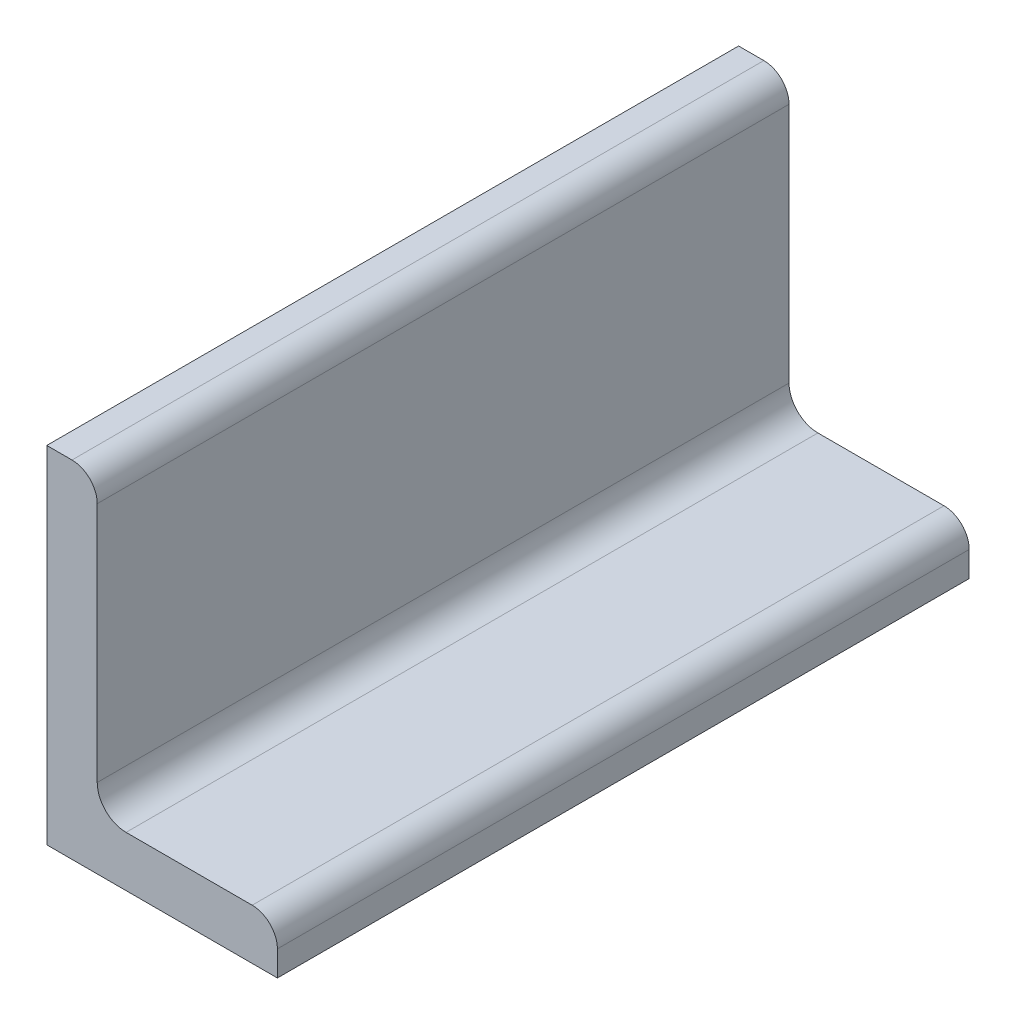
ISO-10303-21;
HEADER;
FILE_DESCRIPTION(('STEP AP214'),'2;1');
FILE_NAME('part.step','',(''),(''),'','','');
FILE_SCHEMA(('AUTOMOTIVE_DESIGN { 1 0 10303 214 1 1 1 1 }'));
ENDSEC;
DATA;
#1=APPLICATION_CONTEXT('core data for automotive mechanical design processes');
#2=APPLICATION_PROTOCOL_DEFINITION('international standard','automotive_design',2000,#1);
#3=PRODUCT_CONTEXT('',#1,'mechanical');
#4=PRODUCT('Part','Part','',(#3));
#5=PRODUCT_RELATED_PRODUCT_CATEGORY('part','',(#4));
#6=PRODUCT_DEFINITION_FORMATION('','',#4);
#7=PRODUCT_DEFINITION_CONTEXT('part definition',#1,'design');
#8=PRODUCT_DEFINITION('design','',#6,#7);
#9=PRODUCT_DEFINITION_SHAPE('','',#8);
#10=(LENGTH_UNIT() NAMED_UNIT(*) SI_UNIT(.MILLI.,.METRE.));
#11=(NAMED_UNIT(*) PLANE_ANGLE_UNIT() SI_UNIT($,.RADIAN.));
#12=(NAMED_UNIT(*) SI_UNIT($,.STERADIAN.) SOLID_ANGLE_UNIT());
#13=UNCERTAINTY_MEASURE_WITH_UNIT(LENGTH_MEASURE(1.E-05),#10,'distance_accuracy_value','');
#14=(GEOMETRIC_REPRESENTATION_CONTEXT(3) GLOBAL_UNCERTAINTY_ASSIGNED_CONTEXT((#13)) GLOBAL_UNIT_ASSIGNED_CONTEXT((#10,
#11,#12)) REPRESENTATION_CONTEXT('',''));
#15=CARTESIAN_POINT('',(0.,0.,0.));
#16=DIRECTION('',(0.,0.,1.));
#17=DIRECTION('',(1.,0.,0.));
#18=AXIS2_PLACEMENT_3D('',#15,#16,#17);
#19=CARTESIAN_POINT('',(0.865045893659089,152.925428131371,304.8));
#20=DIRECTION('',(1.,0.,0.));
#21=DIRECTION('',(0.,0.,-1.));
#22=AXIS2_PLACEMENT_3D('',#19,#20,#21);
#23=PLANE('',#22);
#24=DIRECTION('',(0.,-1.,0.));
#25=VECTOR('',#24,1.);
#26=CARTESIAN_POINT('',(0.865045893659089,152.925428131371,0.));
#27=LINE('',#26,#25);
#28=CARTESIAN_POINT('',(0.865045893659089,152.925428131371,0.));
#29=VERTEX_POINT('',#28);
#30=CARTESIAN_POINT('',(0.865045893659089,0.525428131371291,0.));
#31=VERTEX_POINT('',#30);
#32=EDGE_CURVE('E135',#29,#31,#27,.T.);
#33=ORIENTED_EDGE('',*,*,#32,.T.);
#34=DIRECTION('',(0.,0.,-1.));
#35=VECTOR('',#34,1.);
#36=CARTESIAN_POINT('',(0.865045893659089,0.525428131371291,304.8));
#37=LINE('',#36,#35);
#38=CARTESIAN_POINT('',(0.865045893659089,0.525428131371291,304.8));
#39=VERTEX_POINT('',#38);
#40=EDGE_CURVE('E11',#39,#31,#37,.T.);
#41=ORIENTED_EDGE('',*,*,#40,.F.);
#42=DIRECTION('',(0.,-1.,0.));
#43=VECTOR('',#42,1.);
#44=CARTESIAN_POINT('',(0.865045893659089,152.925428131371,304.8));
#45=LINE('',#44,#43);
#46=CARTESIAN_POINT('',(0.865045893659089,152.925428131371,304.8));
#47=VERTEX_POINT('',#46);
#48=EDGE_CURVE('E151',#47,#39,#45,.T.);
#49=ORIENTED_EDGE('',*,*,#48,.F.);
#50=DIRECTION('',(0.,0.,-1.));
#51=VECTOR('',#50,1.);
#52=CARTESIAN_POINT('',(0.865045893659089,152.925428131371,304.8));
#53=LINE('',#52,#51);
#54=EDGE_CURVE('E131',#47,#29,#53,.T.);
#55=ORIENTED_EDGE('',*,*,#54,.T.);
#56=EDGE_LOOP('',(#33,#41,#49,#55));
#57=FACE_BOUND('',#56,.T.);
#58=ADVANCED_FACE('F33',(#57),#23,.F.);
#59=CARTESIAN_POINT('',(0.865045893659089,0.525428131371291,304.8));
#60=DIRECTION('',(0.,1.,0.));
#61=DIRECTION('',(0.,0.,1.));
#62=AXIS2_PLACEMENT_3D('',#59,#60,#61);
#63=PLANE('',#62);
#64=DIRECTION('',(1.,0.,0.));
#65=VECTOR('',#64,1.);
#66=CARTESIAN_POINT('',(0.865045893659089,0.525428131371291,0.));
#67=LINE('',#66,#65);
#68=CARTESIAN_POINT('',(102.465045893659,0.525428131371291,0.));
#69=VERTEX_POINT('',#68);
#70=EDGE_CURVE('E138',#31,#69,#67,.T.);
#71=ORIENTED_EDGE('',*,*,#70,.T.);
#72=DIRECTION('',(0.,0.,-1.));
#73=VECTOR('',#72,1.);
#74=CARTESIAN_POINT('',(102.465045893659,0.525428131371291,304.8));
#75=LINE('',#74,#73);
#76=CARTESIAN_POINT('',(102.465045893659,0.525428131371291,304.8));
#77=VERTEX_POINT('',#76);
#78=EDGE_CURVE('E41',#77,#69,#75,.T.);
#79=ORIENTED_EDGE('',*,*,#78,.F.);
#80=DIRECTION('',(1.,0.,0.));
#81=VECTOR('',#80,1.);
#82=CARTESIAN_POINT('',(0.865045893659089,0.525428131371291,304.8));
#83=LINE('',#82,#81);
#84=EDGE_CURVE('E95',#39,#77,#83,.T.);
#85=ORIENTED_EDGE('',*,*,#84,.F.);
#86=ORIENTED_EDGE('',*,*,#40,.T.);
#87=EDGE_LOOP('',(#71,#79,#85,#86));
#88=FACE_BOUND('',#87,.T.);
#89=ADVANCED_FACE('F194',(#88),#63,.F.);
#90=CARTESIAN_POINT('',(102.465045893659,0.525428131371291,304.8));
#91=DIRECTION('',(-1.,0.,0.));
#92=DIRECTION('',(0.,0.,1.));
#93=AXIS2_PLACEMENT_3D('',#90,#91,#92);
#94=PLANE('',#93);
#95=DIRECTION('',(0.,1.,0.));
#96=VECTOR('',#95,1.);
#97=CARTESIAN_POINT('',(102.465045893659,0.525428131371291,0.));
#98=LINE('',#97,#96);
#99=CARTESIAN_POINT('',(102.465045893659,11.6379281313713,0.));
#100=VERTEX_POINT('',#99);
#101=EDGE_CURVE('E140',#69,#100,#98,.T.);
#102=ORIENTED_EDGE('',*,*,#101,.T.);
#103=DIRECTION('',(0.,0.,-1.));
#104=VECTOR('',#103,1.);
#105=CARTESIAN_POINT('',(102.465045893659,11.6379281313713,304.8));
#106=LINE('',#105,#104);
#107=CARTESIAN_POINT('',(102.465045893659,11.6379281313713,304.8));
#108=VERTEX_POINT('',#107);
#109=EDGE_CURVE('E161',#108,#100,#106,.T.);
#110=ORIENTED_EDGE('',*,*,#109,.F.);
#111=DIRECTION('',(0.,1.,0.));
#112=VECTOR('',#111,1.);
#113=CARTESIAN_POINT('',(102.465045893659,0.525428131371291,304.8));
#114=LINE('',#113,#112);
#115=EDGE_CURVE('E169',#77,#108,#114,.T.);
#116=ORIENTED_EDGE('',*,*,#115,.F.);
#117=ORIENTED_EDGE('',*,*,#78,.T.);
#118=EDGE_LOOP('',(#102,#110,#116,#117));
#119=FACE_BOUND('',#118,.T.);
#120=ADVANCED_FACE('F167',(#119),#94,.F.);
#121=CARTESIAN_POINT('',(91.3525458936591,11.6379281313713,304.8));
#122=DIRECTION('',(0.,0.,-1.));
#123=DIRECTION('',(-1.,0.,0.));
#124=AXIS2_PLACEMENT_3D('',#121,#122,#123);
#125=CYLINDRICAL_SURFACE('',#124,11.1125);
#126=CARTESIAN_POINT('',(91.3525458936591,11.6379281313713,0.));
#127=DIRECTION('',(0.,0.,1.));
#128=DIRECTION('',(1.,0.,0.));
#129=AXIS2_PLACEMENT_3D('',#126,#127,#128);
#130=CIRCLE('',#129,11.1125);
#131=CARTESIAN_POINT('',(91.3525458936591,22.7504281313713,0.));
#132=VERTEX_POINT('',#131);
#133=EDGE_CURVE('E142',#100,#132,#130,.T.);
#134=ORIENTED_EDGE('',*,*,#133,.T.);
#135=DIRECTION('',(0.,0.,-1.));
#136=VECTOR('',#135,1.);
#137=CARTESIAN_POINT('',(91.3525458936591,22.7504281313713,304.8));
#138=LINE('',#137,#136);
#139=CARTESIAN_POINT('',(91.3525458936591,22.7504281313713,304.8));
#140=VERTEX_POINT('',#139);
#141=EDGE_CURVE('E158',#140,#132,#138,.T.);
#142=ORIENTED_EDGE('',*,*,#141,.F.);
#143=CARTESIAN_POINT('',(91.3525458936591,11.6379281313713,304.8));
#144=DIRECTION('',(0.,0.,1.));
#145=DIRECTION('',(1.,0.,0.));
#146=AXIS2_PLACEMENT_3D('',#143,#144,#145);
#147=CIRCLE('',#146,11.1125);
#148=EDGE_CURVE('E185',#108,#140,#147,.T.);
#149=ORIENTED_EDGE('',*,*,#148,.F.);
#150=ORIENTED_EDGE('',*,*,#109,.T.);
#151=EDGE_LOOP('',(#134,#142,#149,#150));
#152=FACE_BOUND('',#151,.T.);
#153=ADVANCED_FACE('F178',(#152),#125,.T.);
#154=CARTESIAN_POINT('',(91.3525458936591,22.7504281313713,304.8));
#155=DIRECTION('',(0.,-1.,0.));
#156=DIRECTION('',(0.,0.,-1.));
#157=AXIS2_PLACEMENT_3D('',#154,#155,#156);
#158=PLANE('',#157);
#159=DIRECTION('',(-1.,0.,0.));
#160=VECTOR('',#159,1.);
#161=CARTESIAN_POINT('',(91.3525458936591,22.7504281313713,0.));
#162=LINE('',#161,#160);
#163=CARTESIAN_POINT('',(35.7900458936591,22.7504281313713,0.));
#164=VERTEX_POINT('',#163);
#165=EDGE_CURVE('E144',#132,#164,#162,.T.);
#166=ORIENTED_EDGE('',*,*,#165,.T.);
#167=DIRECTION('',(0.,0.,-1.));
#168=VECTOR('',#167,1.);
#169=CARTESIAN_POINT('',(35.7900458936591,22.7504281313713,304.8));
#170=LINE('',#169,#168);
#171=CARTESIAN_POINT('',(35.7900458936591,22.7504281313713,304.8));
#172=VERTEX_POINT('',#171);
#173=EDGE_CURVE('E155',#172,#164,#170,.T.);
#174=ORIENTED_EDGE('',*,*,#173,.F.);
#175=DIRECTION('',(-1.,0.,0.));
#176=VECTOR('',#175,1.);
#177=CARTESIAN_POINT('',(91.3525458936591,22.7504281313713,304.8));
#178=LINE('',#177,#176);
#179=EDGE_CURVE('E184',#140,#172,#178,.T.);
#180=ORIENTED_EDGE('',*,*,#179,.F.);
#181=ORIENTED_EDGE('',*,*,#141,.T.);
#182=EDGE_LOOP('',(#166,#174,#180,#181));
#183=FACE_BOUND('',#182,.T.);
#184=ADVANCED_FACE('F182',(#183),#158,.F.);
#185=CARTESIAN_POINT('',(35.7900458936591,35.4504281313713,304.8));
#186=DIRECTION('',(0.,0.,-1.));
#187=DIRECTION('',(-1.,0.,0.));
#188=AXIS2_PLACEMENT_3D('',#185,#186,#187);
#189=CYLINDRICAL_SURFACE('',#188,12.7);
#190=CARTESIAN_POINT('',(35.7900458936591,35.4504281313713,0.));
#191=DIRECTION('',(0.,0.,-1.));
#192=DIRECTION('',(1.,0.,0.));
#193=AXIS2_PLACEMENT_3D('',#190,#191,#192);
#194=CIRCLE('',#193,12.7);
#195=CARTESIAN_POINT('',(23.0900458936591,35.4504281313713,0.));
#196=VERTEX_POINT('',#195);
#197=EDGE_CURVE('E146',#164,#196,#194,.T.);
#198=ORIENTED_EDGE('',*,*,#197,.T.);
#199=DIRECTION('',(0.,0.,-1.));
#200=VECTOR('',#199,1.);
#201=CARTESIAN_POINT('',(23.0900458936591,35.4504281313713,304.8));
#202=LINE('',#201,#200);
#203=CARTESIAN_POINT('',(23.0900458936591,35.4504281313713,304.8));
#204=VERTEX_POINT('',#203);
#205=EDGE_CURVE('E126',#204,#196,#202,.T.);
#206=ORIENTED_EDGE('',*,*,#205,.F.);
#207=CARTESIAN_POINT('',(35.7900458936591,35.4504281313713,304.8));
#208=DIRECTION('',(0.,0.,-1.));
#209=DIRECTION('',(1.,0.,0.));
#210=AXIS2_PLACEMENT_3D('',#207,#208,#209);
#211=CIRCLE('',#210,12.7);
#212=EDGE_CURVE('E117',#172,#204,#211,.T.);
#213=ORIENTED_EDGE('',*,*,#212,.F.);
#214=ORIENTED_EDGE('',*,*,#173,.T.);
#215=EDGE_LOOP('',(#198,#206,#213,#214));
#216=FACE_BOUND('',#215,.T.);
#217=ADVANCED_FACE('F206',(#216),#189,.F.);
#218=CARTESIAN_POINT('',(23.0900458936591,35.4504281313713,304.8));
#219=DIRECTION('',(-1.,0.,0.));
#220=DIRECTION('',(0.,0.,1.));
#221=AXIS2_PLACEMENT_3D('',#218,#219,#220);
#222=PLANE('',#221);
#223=DIRECTION('',(0.,1.,0.));
#224=VECTOR('',#223,1.);
#225=CARTESIAN_POINT('',(23.0900458936591,35.4504281313713,0.));
#226=LINE('',#225,#224);
#227=CARTESIAN_POINT('',(23.0900458936591,141.812928131371,0.));
#228=VERTEX_POINT('',#227);
#229=EDGE_CURVE('E125',#196,#228,#226,.T.);
#230=ORIENTED_EDGE('',*,*,#229,.T.);
#231=DIRECTION('',(0.,0.,-1.));
#232=VECTOR('',#231,1.);
#233=CARTESIAN_POINT('',(23.0900458936591,141.812928131371,304.8));
#234=LINE('',#233,#232);
#235=CARTESIAN_POINT('',(23.0900458936591,141.812928131371,304.8));
#236=VERTEX_POINT('',#235);
#237=EDGE_CURVE('E122',#236,#228,#234,.T.);
#238=ORIENTED_EDGE('',*,*,#237,.F.);
#239=DIRECTION('',(0.,1.,0.));
#240=VECTOR('',#239,1.);
#241=CARTESIAN_POINT('',(23.0900458936591,35.4504281313713,304.8));
#242=LINE('',#241,#240);
#243=EDGE_CURVE('E111',#204,#236,#242,.T.);
#244=ORIENTED_EDGE('',*,*,#243,.F.);
#245=ORIENTED_EDGE('',*,*,#205,.T.);
#246=EDGE_LOOP('',(#230,#238,#244,#245));
#247=FACE_BOUND('',#246,.T.);
#248=ADVANCED_FACE('F123',(#247),#222,.F.);
#249=CARTESIAN_POINT('',(11.9775458936591,141.812928131371,304.8));
#250=DIRECTION('',(0.,0.,-1.));
#251=DIRECTION('',(-1.,0.,0.));
#252=AXIS2_PLACEMENT_3D('',#249,#250,#251);
#253=CYLINDRICAL_SURFACE('',#252,11.1125);
#254=CARTESIAN_POINT('',(11.9775458936591,141.812928131371,0.));
#255=DIRECTION('',(0.,0.,1.));
#256=DIRECTION('',(1.,0.,0.));
#257=AXIS2_PLACEMENT_3D('',#254,#255,#256);
#258=CIRCLE('',#257,11.1125);
#259=CARTESIAN_POINT('',(11.9775458936591,152.925428131371,0.));
#260=VERTEX_POINT('',#259);
#261=EDGE_CURVE('E81',#228,#260,#258,.T.);
#262=ORIENTED_EDGE('',*,*,#261,.T.);
#263=DIRECTION('',(0.,0.,-1.));
#264=VECTOR('',#263,1.);
#265=CARTESIAN_POINT('',(11.9775458936591,152.925428131371,304.8));
#266=LINE('',#265,#264);
#267=CARTESIAN_POINT('',(11.9775458936591,152.925428131371,304.8));
#268=VERTEX_POINT('',#267);
#269=EDGE_CURVE('E127',#268,#260,#266,.T.);
#270=ORIENTED_EDGE('',*,*,#269,.F.);
#271=CARTESIAN_POINT('',(11.9775458936591,141.812928131371,304.8));
#272=DIRECTION('',(0.,0.,1.));
#273=DIRECTION('',(1.,0.,0.));
#274=AXIS2_PLACEMENT_3D('',#271,#272,#273);
#275=CIRCLE('',#274,11.1125);
#276=EDGE_CURVE('E115',#236,#268,#275,.T.);
#277=ORIENTED_EDGE('',*,*,#276,.F.);
#278=ORIENTED_EDGE('',*,*,#237,.T.);
#279=EDGE_LOOP('',(#262,#270,#277,#278));
#280=FACE_BOUND('',#279,.T.);
#281=ADVANCED_FACE('F129',(#280),#253,.T.);
#282=CARTESIAN_POINT('',(11.9775458936591,152.925428131371,304.8));
#283=DIRECTION('',(0.,-1.,0.));
#284=DIRECTION('',(0.,0.,-1.));
#285=AXIS2_PLACEMENT_3D('',#282,#283,#284);
#286=PLANE('',#285);
#287=DIRECTION('',(-1.,0.,0.));
#288=VECTOR('',#287,1.);
#289=CARTESIAN_POINT('',(11.9775458936591,152.925428131371,0.));
#290=LINE('',#289,#288);
#291=EDGE_CURVE('E87',#260,#29,#290,.T.);
#292=ORIENTED_EDGE('',*,*,#291,.T.);
#293=ORIENTED_EDGE('',*,*,#54,.F.);
#294=DIRECTION('',(-1.,0.,0.));
#295=VECTOR('',#294,1.);
#296=CARTESIAN_POINT('',(11.9775458936591,152.925428131371,304.8));
#297=LINE('',#296,#295);
#298=EDGE_CURVE('E49',#268,#47,#297,.T.);
#299=ORIENTED_EDGE('',*,*,#298,.F.);
#300=ORIENTED_EDGE('',*,*,#269,.T.);
#301=EDGE_LOOP('',(#292,#293,#299,#300));
#302=FACE_BOUND('',#301,.T.);
#303=ADVANCED_FACE('F214',(#302),#286,.F.);
#304=CARTESIAN_POINT('',(91.3525458936591,11.6379281313713,304.8));
#305=DIRECTION('',(0.,0.,1.));
#306=DIRECTION('',(1.,0.,0.));
#307=AXIS2_PLACEMENT_3D('',#304,#305,#306);
#308=PLANE('',#307);
#309=ORIENTED_EDGE('',*,*,#48,.T.);
#310=ORIENTED_EDGE('',*,*,#84,.T.);
#311=ORIENTED_EDGE('',*,*,#115,.T.);
#312=ORIENTED_EDGE('',*,*,#148,.T.);
#313=ORIENTED_EDGE('',*,*,#179,.T.);
#314=ORIENTED_EDGE('',*,*,#212,.T.);
#315=ORIENTED_EDGE('',*,*,#243,.T.);
#316=ORIENTED_EDGE('',*,*,#276,.T.);
#317=ORIENTED_EDGE('',*,*,#298,.T.);
#318=EDGE_LOOP('',(#309,#310,#311,#312,#313,#314,#315,#316,#317));
#319=FACE_BOUND('',#318,.T.);
#320=ADVANCED_FACE('F113',(#319),#308,.T.);
#321=CARTESIAN_POINT('',(91.3525458936591,11.6379281313713,0.));
#322=DIRECTION('',(0.,0.,1.));
#323=DIRECTION('',(1.,0.,0.));
#324=AXIS2_PLACEMENT_3D('',#321,#322,#323);
#325=PLANE('',#324);
#326=ORIENTED_EDGE('',*,*,#32,.F.);
#327=ORIENTED_EDGE('',*,*,#291,.F.);
#328=ORIENTED_EDGE('',*,*,#261,.F.);
#329=ORIENTED_EDGE('',*,*,#229,.F.);
#330=ORIENTED_EDGE('',*,*,#197,.F.);
#331=ORIENTED_EDGE('',*,*,#165,.F.);
#332=ORIENTED_EDGE('',*,*,#133,.F.);
#333=ORIENTED_EDGE('',*,*,#101,.F.);
#334=ORIENTED_EDGE('',*,*,#70,.F.);
#335=EDGE_LOOP('',(#326,#327,#328,#329,#330,#331,#332,#333,#334));
#336=FACE_BOUND('',#335,.T.);
#337=ADVANCED_FACE('F173',(#336),#325,.F.);
#338=CLOSED_SHELL('',(#58,#89,#120,#153,#184,#217,#248,#281,#303,#320,#337));
#339=MANIFOLD_SOLID_BREP('B2',#338);
#340=ADVANCED_BREP_SHAPE_REPRESENTATION('',(#18,#339),#14);
#341=SHAPE_DEFINITION_REPRESENTATION(#9,#340);
ENDSEC;
END-ISO-10303-21;
